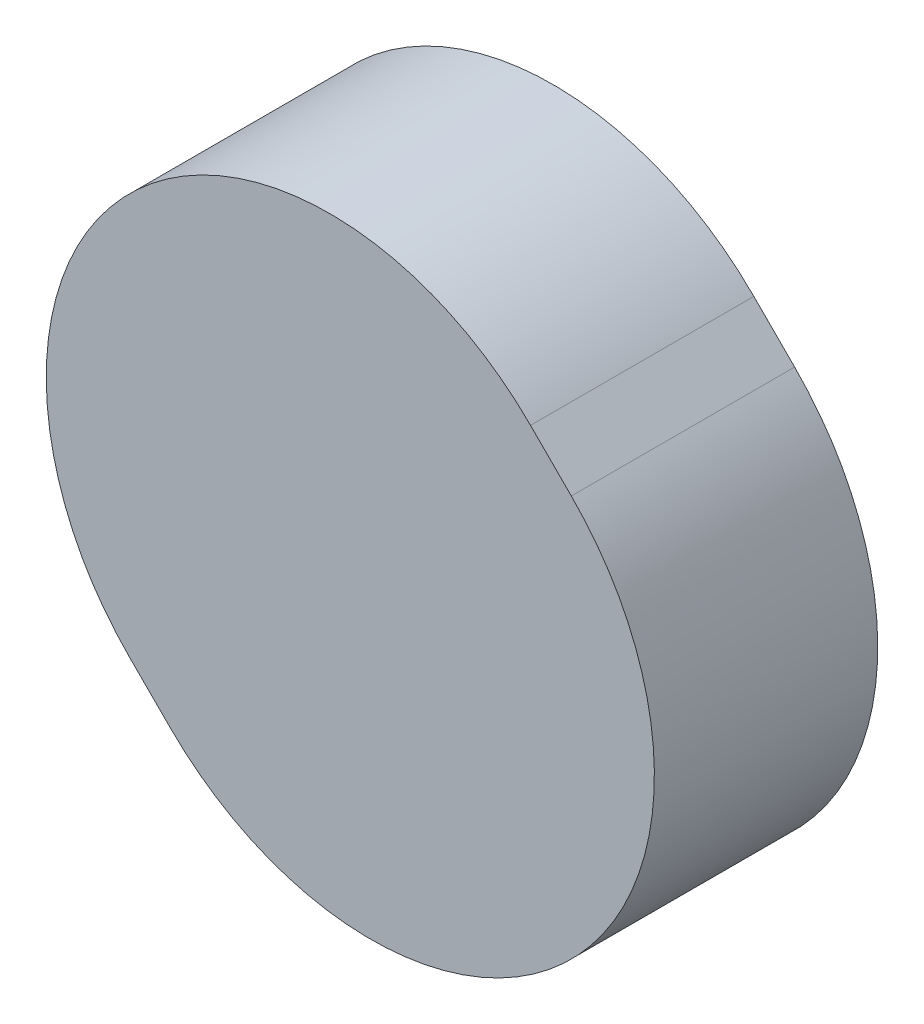
ISO-10303-21;
HEADER;
FILE_DESCRIPTION(('STEP AP214'),'2;1');
FILE_NAME('part.step','',(''),(''),'','','');
FILE_SCHEMA(('AUTOMOTIVE_DESIGN { 1 0 10303 214 1 1 1 1 }'));
ENDSEC;
DATA;
#1=APPLICATION_CONTEXT('core data for automotive mechanical design processes');
#2=APPLICATION_PROTOCOL_DEFINITION('international standard','automotive_design',2000,#1);
#3=PRODUCT_CONTEXT('',#1,'mechanical');
#4=PRODUCT('Part','Part','',(#3));
#5=PRODUCT_RELATED_PRODUCT_CATEGORY('part','',(#4));
#6=PRODUCT_DEFINITION_FORMATION('','',#4);
#7=PRODUCT_DEFINITION_CONTEXT('part definition',#1,'design');
#8=PRODUCT_DEFINITION('design','',#6,#7);
#9=PRODUCT_DEFINITION_SHAPE('','',#8);
#10=(LENGTH_UNIT() NAMED_UNIT(*) SI_UNIT(.MILLI.,.METRE.));
#11=(NAMED_UNIT(*) PLANE_ANGLE_UNIT() SI_UNIT($,.RADIAN.));
#12=(NAMED_UNIT(*) SI_UNIT($,.STERADIAN.) SOLID_ANGLE_UNIT());
#13=UNCERTAINTY_MEASURE_WITH_UNIT(LENGTH_MEASURE(1.E-05),#10,'distance_accuracy_value','');
#14=(GEOMETRIC_REPRESENTATION_CONTEXT(3) GLOBAL_UNCERTAINTY_ASSIGNED_CONTEXT((#13)) GLOBAL_UNIT_ASSIGNED_CONTEXT((#10,
#11,#12)) REPRESENTATION_CONTEXT('',''));
#15=CARTESIAN_POINT('',(0.,0.,0.));
#16=DIRECTION('',(0.,0.,1.));
#17=DIRECTION('',(1.,0.,0.));
#18=AXIS2_PLACEMENT_3D('',#15,#16,#17);
#19=CARTESIAN_POINT('',(110.33579406,54.97491926,0.));
#20=DIRECTION('',(0.707106781186341,0.707106781186754,0.));
#21=DIRECTION('',(0.707106781186754,-0.707106781186341,0.));
#22=AXIS2_PLACEMENT_3D('',#19,#20,#21);
#23=PLANE('',#22);
#24=DIRECTION('',(0.707106781186754,-0.707106781186341,0.));
#25=VECTOR('',#24,1.);
#26=CARTESIAN_POINT('',(110.33579406,54.97491926,0.1999996));
#27=LINE('',#26,#25);
#28=CARTESIAN_POINT('',(110.33579406,54.97491926,0.1999996));
#29=VERTEX_POINT('',#28);
#30=CARTESIAN_POINT('',(110.37231926,54.93839406,0.1999996));
#31=VERTEX_POINT('',#30);
#32=EDGE_CURVE('E11',#29,#31,#27,.T.);
#33=ORIENTED_EDGE('',*,*,#32,.F.);
#34=DIRECTION('',(0.,0.,1.));
#35=VECTOR('',#34,1.);
#36=CARTESIAN_POINT('',(110.33579406,54.97491926,0.));
#37=LINE('',#36,#35);
#38=CARTESIAN_POINT('',(110.33579406,54.97491926,0.));
#39=VERTEX_POINT('',#38);
#40=EDGE_CURVE('E24',#39,#29,#37,.T.);
#41=ORIENTED_EDGE('',*,*,#40,.F.);
#42=DIRECTION('',(0.707106781186754,-0.707106781186341,0.));
#43=VECTOR('',#42,1.);
#44=CARTESIAN_POINT('',(110.33579406,54.97491926,0.));
#45=LINE('',#44,#43);
#46=CARTESIAN_POINT('',(110.37231926,54.93839406,0.));
#47=VERTEX_POINT('',#46);
#48=EDGE_CURVE('E75',#39,#47,#45,.T.);
#49=ORIENTED_EDGE('',*,*,#48,.T.);
#50=DIRECTION('',(0.,0.,1.));
#51=VECTOR('',#50,1.);
#52=CARTESIAN_POINT('',(110.37231926,54.93839406,0.));
#53=LINE('',#52,#51);
#54=EDGE_CURVE('E37',#47,#31,#53,.T.);
#55=ORIENTED_EDGE('',*,*,#54,.T.);
#56=EDGE_LOOP('',(#33,#41,#49,#55));
#57=FACE_BOUND('',#56,.T.);
#58=ADVANCED_FACE('F17',(#57),#23,.F.);
#59=CARTESIAN_POINT('',(110.5519252,55.118,0.));
#60=DIRECTION('',(0.,0.,-1.));
#61=DIRECTION('',(-0.707106781186548,-0.707106781186548,0.));
#62=AXIS2_PLACEMENT_3D('',#59,#60,#61);
#63=CYLINDRICAL_SURFACE('',#62,0.254001156230771);
#64=CARTESIAN_POINT('',(110.5519252,55.118,0.1999996));
#65=DIRECTION('',(0.,0.,1.));
#66=DIRECTION('',(-0.707106781186548,-0.707106781186548,0.));
#67=AXIS2_PLACEMENT_3D('',#64,#65,#66);
#68=CIRCLE('',#67,0.254001156230771);
#69=CARTESIAN_POINT('',(110.73153114,55.29760594,0.1999996));
#70=VERTEX_POINT('',#69);
#71=EDGE_CURVE('E83',#31,#70,#68,.T.);
#72=ORIENTED_EDGE('',*,*,#71,.F.);
#73=ORIENTED_EDGE('',*,*,#54,.F.);
#74=CARTESIAN_POINT('',(110.5519252,55.118,0.));
#75=DIRECTION('',(0.,0.,1.));
#76=DIRECTION('',(-0.707106781186548,-0.707106781186548,0.));
#77=AXIS2_PLACEMENT_3D('',#74,#75,#76);
#78=CIRCLE('',#77,0.254001156230771);
#79=CARTESIAN_POINT('',(110.73153114,55.29760594,0.));
#80=VERTEX_POINT('',#79);
#81=EDGE_CURVE('E81',#47,#80,#78,.T.);
#82=ORIENTED_EDGE('',*,*,#81,.T.);
#83=DIRECTION('',(0.,0.,1.));
#84=VECTOR('',#83,1.);
#85=CARTESIAN_POINT('',(110.73153114,55.29760594,0.));
#86=LINE('',#85,#84);
#87=EDGE_CURVE('E67',#80,#70,#86,.T.);
#88=ORIENTED_EDGE('',*,*,#87,.T.);
#89=EDGE_LOOP('',(#72,#73,#82,#88));
#90=FACE_BOUND('',#89,.T.);
#91=ADVANCED_FACE('F89',(#90),#63,.T.);
#92=CARTESIAN_POINT('',(110.73153114,55.29760594,0.));
#93=DIRECTION('',(-0.70710678118641,-0.707106781186685,0.));
#94=DIRECTION('',(-0.707106781186685,0.70710678118641,0.));
#95=AXIS2_PLACEMENT_3D('',#92,#93,#94);
#96=PLANE('',#95);
#97=DIRECTION('',(-0.707106781186685,0.70710678118641,0.));
#98=VECTOR('',#97,1.);
#99=CARTESIAN_POINT('',(110.73153114,55.29760594,0.1999996));
#100=LINE('',#99,#98);
#101=CARTESIAN_POINT('',(110.69500594,55.33413114,0.1999996));
#102=VERTEX_POINT('',#101);
#103=EDGE_CURVE('E71',#70,#102,#100,.T.);
#104=ORIENTED_EDGE('',*,*,#103,.F.);
#105=ORIENTED_EDGE('',*,*,#87,.F.);
#106=DIRECTION('',(-0.707106781186685,0.70710678118641,0.));
#107=VECTOR('',#106,1.);
#108=CARTESIAN_POINT('',(110.73153114,55.29760594,0.));
#109=LINE('',#108,#107);
#110=CARTESIAN_POINT('',(110.69500594,55.33413114,0.));
#111=VERTEX_POINT('',#110);
#112=EDGE_CURVE('E63',#80,#111,#109,.T.);
#113=ORIENTED_EDGE('',*,*,#112,.T.);
#114=DIRECTION('',(0.,0.,1.));
#115=VECTOR('',#114,1.);
#116=CARTESIAN_POINT('',(110.69500594,55.33413114,0.));
#117=LINE('',#116,#115);
#118=EDGE_CURVE('E53',#111,#102,#117,.T.);
#119=ORIENTED_EDGE('',*,*,#118,.T.);
#120=EDGE_LOOP('',(#104,#105,#113,#119));
#121=FACE_BOUND('',#120,.T.);
#122=ADVANCED_FACE('F66',(#121),#96,.F.);
#123=CARTESIAN_POINT('',(110.5154,55.1545252,0.));
#124=DIRECTION('',(0.,0.,-1.));
#125=DIRECTION('',(0.707106781186534,0.707106781186562,0.));
#126=AXIS2_PLACEMENT_3D('',#123,#124,#125);
#127=CYLINDRICAL_SURFACE('',#126,0.254001156230774);
#128=CARTESIAN_POINT('',(110.5154,55.1545252,0.1999996));
#129=DIRECTION('',(0.,0.,1.));
#130=DIRECTION('',(0.707106781186534,0.707106781186562,0.));
#131=AXIS2_PLACEMENT_3D('',#128,#129,#130);
#132=CIRCLE('',#131,0.254001156230774);
#133=EDGE_CURVE('E59',#102,#29,#132,.T.);
#134=ORIENTED_EDGE('',*,*,#133,.F.);
#135=ORIENTED_EDGE('',*,*,#118,.F.);
#136=CARTESIAN_POINT('',(110.5154,55.1545252,0.));
#137=DIRECTION('',(0.,0.,1.));
#138=DIRECTION('',(0.707106781186534,0.707106781186562,0.));
#139=AXIS2_PLACEMENT_3D('',#136,#137,#138);
#140=CIRCLE('',#139,0.254001156230774);
#141=EDGE_CURVE('E57',#111,#39,#140,.T.);
#142=ORIENTED_EDGE('',*,*,#141,.T.);
#143=ORIENTED_EDGE('',*,*,#40,.T.);
#144=EDGE_LOOP('',(#134,#135,#142,#143));
#145=FACE_BOUND('',#144,.T.);
#146=ADVANCED_FACE('F55',(#145),#127,.T.);
#147=CARTESIAN_POINT('',(110.33579406,54.97491926,0.));
#148=DIRECTION('',(0.,0.,-1.));
#149=DIRECTION('',(-1.,0.,0.));
#150=AXIS2_PLACEMENT_3D('',#147,#148,#149);
#151=PLANE('',#150);
#152=ORIENTED_EDGE('',*,*,#141,.F.);
#153=ORIENTED_EDGE('',*,*,#112,.F.);
#154=ORIENTED_EDGE('',*,*,#81,.F.);
#155=ORIENTED_EDGE('',*,*,#48,.F.);
#156=EDGE_LOOP('',(#152,#153,#154,#155));
#157=FACE_BOUND('',#156,.T.);
#158=ADVANCED_FACE('F74',(#157),#151,.T.);
#159=CARTESIAN_POINT('',(110.33579406,54.97491926,0.1999996));
#160=DIRECTION('',(0.,0.,-1.));
#161=DIRECTION('',(-1.,0.,0.));
#162=AXIS2_PLACEMENT_3D('',#159,#160,#161);
#163=PLANE('',#162);
#164=ORIENTED_EDGE('',*,*,#32,.T.);
#165=ORIENTED_EDGE('',*,*,#71,.T.);
#166=ORIENTED_EDGE('',*,*,#103,.T.);
#167=ORIENTED_EDGE('',*,*,#133,.T.);
#168=EDGE_LOOP('',(#164,#165,#166,#167));
#169=FACE_BOUND('',#168,.T.);
#170=ADVANCED_FACE('F91',(#169),#163,.F.);
#171=CLOSED_SHELL('',(#58,#91,#122,#146,#158,#170));
#172=MANIFOLD_SOLID_BREP('B1',#171);
#173=ADVANCED_BREP_SHAPE_REPRESENTATION('',(#18,#172),#14);
#174=SHAPE_DEFINITION_REPRESENTATION(#9,#173);
ENDSEC;
END-ISO-10303-21;
